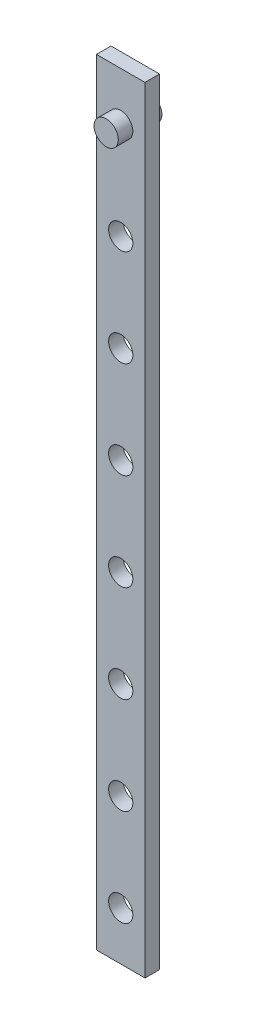
ISO-10303-21;
HEADER;
FILE_DESCRIPTION(('STEP AP214'),'2;1');
FILE_NAME('part.step','',(''),(''),'','','');
FILE_SCHEMA(('AUTOMOTIVE_DESIGN { 1 0 10303 214 1 1 1 1 }'));
ENDSEC;
DATA;
#1=APPLICATION_CONTEXT('core data for automotive mechanical design processes');
#2=APPLICATION_PROTOCOL_DEFINITION('international standard','automotive_design',2000,#1);
#3=PRODUCT_CONTEXT('',#1,'mechanical');
#4=PRODUCT('Part','Part','',(#3));
#5=PRODUCT_RELATED_PRODUCT_CATEGORY('part','',(#4));
#6=PRODUCT_DEFINITION_FORMATION('','',#4);
#7=PRODUCT_DEFINITION_CONTEXT('part definition',#1,'design');
#8=PRODUCT_DEFINITION('design','',#6,#7);
#9=PRODUCT_DEFINITION_SHAPE('','',#8);
#10=(LENGTH_UNIT() NAMED_UNIT(*) SI_UNIT(.MILLI.,.METRE.));
#11=(NAMED_UNIT(*) PLANE_ANGLE_UNIT() SI_UNIT($,.RADIAN.));
#12=(NAMED_UNIT(*) SI_UNIT($,.STERADIAN.) SOLID_ANGLE_UNIT());
#13=UNCERTAINTY_MEASURE_WITH_UNIT(LENGTH_MEASURE(1.E-05),#10,'distance_accuracy_value','');
#14=(GEOMETRIC_REPRESENTATION_CONTEXT(3) GLOBAL_UNCERTAINTY_ASSIGNED_CONTEXT((#13)) GLOBAL_UNIT_ASSIGNED_CONTEXT((#10,
#11,#12)) REPRESENTATION_CONTEXT('',''));
#15=CARTESIAN_POINT('',(0.,0.,0.));
#16=DIRECTION('',(0.,0.,1.));
#17=DIRECTION('',(1.,0.,0.));
#18=AXIS2_PLACEMENT_3D('',#15,#16,#17);
#19=CARTESIAN_POINT('',(0.,0.,3.));
#20=DIRECTION('',(0.,0.,-1.));
#21=DIRECTION('',(-1.,0.,0.));
#22=AXIS2_PLACEMENT_3D('',#19,#20,#21);
#23=PLANE('',#22);
#24=CARTESIAN_POINT('',(0.,70.,3.));
#25=DIRECTION('',(0.,0.,-1.));
#26=DIRECTION('',(-1.,0.,0.));
#27=AXIS2_PLACEMENT_3D('',#24,#25,#26);
#28=CIRCLE('',#27,2.5);
#29=CARTESIAN_POINT('',(-2.5,70.,3.));
#30=VERTEX_POINT('',#29);
#31=EDGE_CURVE('E133',#30,#30,#28,.T.);
#32=ORIENTED_EDGE('',*,*,#31,.T.);
#33=EDGE_LOOP('',(#32));
#34=FACE_BOUND('',#33,.T.);
#35=DIRECTION('',(0.,1.,0.));
#36=VECTOR('',#35,1.);
#37=CARTESIAN_POINT('',(4.99999999999997,-80.,3.));
#38=LINE('',#37,#36);
#39=CARTESIAN_POINT('',(4.99999999999997,-80.,3.));
#40=VERTEX_POINT('',#39);
#41=CARTESIAN_POINT('',(5.00000000000003,80.,3.));
#42=VERTEX_POINT('',#41);
#43=EDGE_CURVE('E86',#40,#42,#38,.T.);
#44=ORIENTED_EDGE('',*,*,#43,.T.);
#45=DIRECTION('',(-1.,0.,0.));
#46=VECTOR('',#45,1.);
#47=CARTESIAN_POINT('',(-4.99999999999997,80.,3.));
#48=LINE('',#47,#46);
#49=CARTESIAN_POINT('',(-4.99999999999997,80.,3.));
#50=VERTEX_POINT('',#49);
#51=EDGE_CURVE('E81',#42,#50,#48,.T.);
#52=ORIENTED_EDGE('',*,*,#51,.T.);
#53=DIRECTION('',(0.,-1.,0.));
#54=VECTOR('',#53,1.);
#55=CARTESIAN_POINT('',(-4.99999999999997,-80.,3.));
#56=LINE('',#55,#54);
#57=CARTESIAN_POINT('',(-4.99999999999997,-80.,3.));
#58=VERTEX_POINT('',#57);
#59=EDGE_CURVE('E84',#50,#58,#56,.T.);
#60=ORIENTED_EDGE('',*,*,#59,.T.);
#61=DIRECTION('',(1.,0.,0.));
#62=VECTOR('',#61,1.);
#63=CARTESIAN_POINT('',(-4.99999999999997,-80.,3.));
#64=LINE('',#63,#62);
#65=EDGE_CURVE('E50',#58,#40,#64,.T.);
#66=ORIENTED_EDGE('',*,*,#65,.T.);
#67=EDGE_LOOP('',(#44,#52,#60,#66));
#68=FACE_BOUND('',#67,.T.);
#69=CARTESIAN_POINT('',(0.,-70.,3.));
#70=DIRECTION('',(0.,0.,1.));
#71=DIRECTION('',(1.,0.,0.));
#72=AXIS2_PLACEMENT_3D('',#69,#70,#71);
#73=CIRCLE('',#72,2.5);
#74=CARTESIAN_POINT('',(2.5,-70.,3.));
#75=VERTEX_POINT('',#74);
#76=EDGE_CURVE('E103',#75,#75,#73,.T.);
#77=ORIENTED_EDGE('',*,*,#76,.F.);
#78=EDGE_LOOP('',(#77));
#79=FACE_BOUND('',#78,.T.);
#80=CARTESIAN_POINT('',(0.,-50.,3.));
#81=DIRECTION('',(0.,0.,1.));
#82=DIRECTION('',(1.,0.,0.));
#83=AXIS2_PLACEMENT_3D('',#80,#81,#82);
#84=CIRCLE('',#83,2.5);
#85=CARTESIAN_POINT('',(2.5,-50.,3.));
#86=VERTEX_POINT('',#85);
#87=EDGE_CURVE('E162',#86,#86,#84,.T.);
#88=ORIENTED_EDGE('',*,*,#87,.F.);
#89=EDGE_LOOP('',(#88));
#90=FACE_BOUND('',#89,.T.);
#91=CARTESIAN_POINT('',(0.,-30.,3.));
#92=DIRECTION('',(0.,0.,1.));
#93=DIRECTION('',(1.,0.,0.));
#94=AXIS2_PLACEMENT_3D('',#91,#92,#93);
#95=CIRCLE('',#94,2.5);
#96=CARTESIAN_POINT('',(2.5,-30.,3.));
#97=VERTEX_POINT('',#96);
#98=EDGE_CURVE('E157',#97,#97,#95,.T.);
#99=ORIENTED_EDGE('',*,*,#98,.F.);
#100=EDGE_LOOP('',(#99));
#101=FACE_BOUND('',#100,.T.);
#102=CARTESIAN_POINT('',(0.,-10.,3.));
#103=DIRECTION('',(0.,0.,1.));
#104=DIRECTION('',(1.,0.,0.));
#105=AXIS2_PLACEMENT_3D('',#102,#103,#104);
#106=CIRCLE('',#105,2.5);
#107=CARTESIAN_POINT('',(2.5,-10.,3.));
#108=VERTEX_POINT('',#107);
#109=EDGE_CURVE('E152',#108,#108,#106,.T.);
#110=ORIENTED_EDGE('',*,*,#109,.F.);
#111=EDGE_LOOP('',(#110));
#112=FACE_BOUND('',#111,.T.);
#113=CARTESIAN_POINT('',(0.,9.99999999999997,3.));
#114=DIRECTION('',(0.,0.,1.));
#115=DIRECTION('',(1.,0.,0.));
#116=AXIS2_PLACEMENT_3D('',#113,#114,#115);
#117=CIRCLE('',#116,2.5);
#118=CARTESIAN_POINT('',(2.5,9.99999999999997,3.));
#119=VERTEX_POINT('',#118);
#120=EDGE_CURVE('E147',#119,#119,#117,.T.);
#121=ORIENTED_EDGE('',*,*,#120,.F.);
#122=EDGE_LOOP('',(#121));
#123=FACE_BOUND('',#122,.T.);
#124=CARTESIAN_POINT('',(0.,30.,3.));
#125=DIRECTION('',(0.,0.,1.));
#126=DIRECTION('',(1.,0.,0.));
#127=AXIS2_PLACEMENT_3D('',#124,#125,#126);
#128=CIRCLE('',#127,2.5);
#129=CARTESIAN_POINT('',(2.5,30.,3.));
#130=VERTEX_POINT('',#129);
#131=EDGE_CURVE('E142',#130,#130,#128,.T.);
#132=ORIENTED_EDGE('',*,*,#131,.F.);
#133=EDGE_LOOP('',(#132));
#134=FACE_BOUND('',#133,.T.);
#135=CARTESIAN_POINT('',(0.,50.,3.));
#136=DIRECTION('',(0.,0.,1.));
#137=DIRECTION('',(1.,0.,0.));
#138=AXIS2_PLACEMENT_3D('',#135,#136,#137);
#139=CIRCLE('',#138,2.5);
#140=CARTESIAN_POINT('',(2.5,50.,3.));
#141=VERTEX_POINT('',#140);
#142=EDGE_CURVE('E132',#141,#141,#139,.T.);
#143=ORIENTED_EDGE('',*,*,#142,.F.);
#144=EDGE_LOOP('',(#143));
#145=FACE_BOUND('',#144,.T.);
#146=ADVANCED_FACE('F33',(#34,#68,#79,#90,#101,#112,#123,#134,#145),#23,.F.);
#147=CARTESIAN_POINT('',(0.,0.,0.));
#148=DIRECTION('',(0.,0.,-1.));
#149=DIRECTION('',(-1.,0.,0.));
#150=AXIS2_PLACEMENT_3D('',#147,#148,#149);
#151=PLANE('',#150);
#152=CARTESIAN_POINT('',(0.,70.,0.));
#153=DIRECTION('',(0.,0.,-1.));
#154=DIRECTION('',(-1.,0.,0.));
#155=AXIS2_PLACEMENT_3D('',#152,#153,#154);
#156=CIRCLE('',#155,2.5);
#157=CARTESIAN_POINT('',(-2.5,70.,0.));
#158=VERTEX_POINT('',#157);
#159=EDGE_CURVE('E11',#158,#158,#156,.T.);
#160=ORIENTED_EDGE('',*,*,#159,.F.);
#161=EDGE_LOOP('',(#160));
#162=FACE_BOUND('',#161,.T.);
#163=CARTESIAN_POINT('',(0.,30.,0.));
#164=DIRECTION('',(0.,0.,1.));
#165=DIRECTION('',(1.,0.,0.));
#166=AXIS2_PLACEMENT_3D('',#163,#164,#165);
#167=CIRCLE('',#166,2.5);
#168=CARTESIAN_POINT('',(2.5,30.,0.));
#169=VERTEX_POINT('',#168);
#170=EDGE_CURVE('E136',#169,#169,#167,.T.);
#171=ORIENTED_EDGE('',*,*,#170,.T.);
#172=EDGE_LOOP('',(#171));
#173=FACE_BOUND('',#172,.T.);
#174=CARTESIAN_POINT('',(0.,-10.,0.));
#175=DIRECTION('',(0.,0.,1.));
#176=DIRECTION('',(1.,0.,0.));
#177=AXIS2_PLACEMENT_3D('',#174,#175,#176);
#178=CIRCLE('',#177,2.5);
#179=CARTESIAN_POINT('',(2.5,-10.,0.));
#180=VERTEX_POINT('',#179);
#181=EDGE_CURVE('E150',#180,#180,#178,.T.);
#182=ORIENTED_EDGE('',*,*,#181,.T.);
#183=EDGE_LOOP('',(#182));
#184=FACE_BOUND('',#183,.T.);
#185=CARTESIAN_POINT('',(0.,-50.,0.));
#186=DIRECTION('',(0.,0.,1.));
#187=DIRECTION('',(1.,0.,0.));
#188=AXIS2_PLACEMENT_3D('',#185,#186,#187);
#189=CIRCLE('',#188,2.5);
#190=CARTESIAN_POINT('',(2.5,-50.,0.));
#191=VERTEX_POINT('',#190);
#192=EDGE_CURVE('E160',#191,#191,#189,.T.);
#193=ORIENTED_EDGE('',*,*,#192,.T.);
#194=EDGE_LOOP('',(#193));
#195=FACE_BOUND('',#194,.T.);
#196=DIRECTION('',(0.,1.,0.));
#197=VECTOR('',#196,1.);
#198=CARTESIAN_POINT('',(4.99999999999997,-80.,0.));
#199=LINE('',#198,#197);
#200=CARTESIAN_POINT('',(4.99999999999997,-80.,0.));
#201=VERTEX_POINT('',#200);
#202=CARTESIAN_POINT('',(5.00000000000003,80.,0.));
#203=VERTEX_POINT('',#202);
#204=EDGE_CURVE('E100',#201,#203,#199,.T.);
#205=ORIENTED_EDGE('',*,*,#204,.F.);
#206=DIRECTION('',(1.,0.,0.));
#207=VECTOR('',#206,1.);
#208=CARTESIAN_POINT('',(-4.99999999999997,-80.,0.));
#209=LINE('',#208,#207);
#210=CARTESIAN_POINT('',(-4.99999999999997,-80.,0.));
#211=VERTEX_POINT('',#210);
#212=EDGE_CURVE('E73',#211,#201,#209,.T.);
#213=ORIENTED_EDGE('',*,*,#212,.F.);
#214=DIRECTION('',(0.,-1.,0.));
#215=VECTOR('',#214,1.);
#216=CARTESIAN_POINT('',(-4.99999999999997,-80.,0.));
#217=LINE('',#216,#215);
#218=CARTESIAN_POINT('',(-4.99999999999997,80.,0.));
#219=VERTEX_POINT('',#218);
#220=EDGE_CURVE('E67',#219,#211,#217,.T.);
#221=ORIENTED_EDGE('',*,*,#220,.F.);
#222=DIRECTION('',(-1.,0.,0.));
#223=VECTOR('',#222,1.);
#224=CARTESIAN_POINT('',(-4.99999999999997,80.,0.));
#225=LINE('',#224,#223);
#226=EDGE_CURVE('E91',#203,#219,#225,.T.);
#227=ORIENTED_EDGE('',*,*,#226,.F.);
#228=EDGE_LOOP('',(#205,#213,#221,#227));
#229=FACE_BOUND('',#228,.T.);
#230=CARTESIAN_POINT('',(0.,-70.,0.));
#231=DIRECTION('',(0.,0.,1.));
#232=DIRECTION('',(1.,0.,0.));
#233=AXIS2_PLACEMENT_3D('',#230,#231,#232);
#234=CIRCLE('',#233,2.5);
#235=CARTESIAN_POINT('',(2.5,-70.,0.));
#236=VERTEX_POINT('',#235);
#237=EDGE_CURVE('E119',#236,#236,#234,.T.);
#238=ORIENTED_EDGE('',*,*,#237,.T.);
#239=EDGE_LOOP('',(#238));
#240=FACE_BOUND('',#239,.T.);
#241=CARTESIAN_POINT('',(0.,-30.,0.));
#242=DIRECTION('',(0.,0.,1.));
#243=DIRECTION('',(1.,0.,0.));
#244=AXIS2_PLACEMENT_3D('',#241,#242,#243);
#245=CIRCLE('',#244,2.5);
#246=CARTESIAN_POINT('',(2.5,-30.,0.));
#247=VERTEX_POINT('',#246);
#248=EDGE_CURVE('E123',#247,#247,#245,.T.);
#249=ORIENTED_EDGE('',*,*,#248,.T.);
#250=EDGE_LOOP('',(#249));
#251=FACE_BOUND('',#250,.T.);
#252=CARTESIAN_POINT('',(0.,9.99999999999997,0.));
#253=DIRECTION('',(0.,0.,1.));
#254=DIRECTION('',(1.,0.,0.));
#255=AXIS2_PLACEMENT_3D('',#252,#253,#254);
#256=CIRCLE('',#255,2.5);
#257=CARTESIAN_POINT('',(2.5,9.99999999999997,0.));
#258=VERTEX_POINT('',#257);
#259=EDGE_CURVE('E127',#258,#258,#256,.T.);
#260=ORIENTED_EDGE('',*,*,#259,.T.);
#261=EDGE_LOOP('',(#260));
#262=FACE_BOUND('',#261,.T.);
#263=CARTESIAN_POINT('',(0.,50.,0.));
#264=DIRECTION('',(0.,0.,1.));
#265=DIRECTION('',(1.,0.,0.));
#266=AXIS2_PLACEMENT_3D('',#263,#264,#265);
#267=CIRCLE('',#266,2.5);
#268=CARTESIAN_POINT('',(2.5,50.,0.));
#269=VERTEX_POINT('',#268);
#270=EDGE_CURVE('E130',#269,#269,#267,.T.);
#271=ORIENTED_EDGE('',*,*,#270,.T.);
#272=EDGE_LOOP('',(#271));
#273=FACE_BOUND('',#272,.T.);
#274=ADVANCED_FACE('F111',(#162,#173,#184,#195,#229,#240,#251,#262,#273),#151,.T.);
#275=CARTESIAN_POINT('',(4.99999999999997,-80.,3.));
#276=DIRECTION('',(-1.,0.,0.));
#277=DIRECTION('',(0.,-1.,0.));
#278=AXIS2_PLACEMENT_3D('',#275,#276,#277);
#279=PLANE('',#278);
#280=ORIENTED_EDGE('',*,*,#204,.T.);
#281=DIRECTION('',(0.,0.,-1.));
#282=VECTOR('',#281,1.);
#283=CARTESIAN_POINT('',(5.00000000000003,80.,3.));
#284=LINE('',#283,#282);
#285=EDGE_CURVE('E42',#42,#203,#284,.T.);
#286=ORIENTED_EDGE('',*,*,#285,.F.);
#287=ORIENTED_EDGE('',*,*,#43,.F.);
#288=DIRECTION('',(0.,0.,-1.));
#289=VECTOR('',#288,1.);
#290=CARTESIAN_POINT('',(4.99999999999997,-80.,3.));
#291=LINE('',#290,#289);
#292=EDGE_CURVE('E96',#40,#201,#291,.T.);
#293=ORIENTED_EDGE('',*,*,#292,.T.);
#294=EDGE_LOOP('',(#280,#286,#287,#293));
#295=FACE_BOUND('',#294,.T.);
#296=ADVANCED_FACE('F35',(#295),#279,.F.);
#297=CARTESIAN_POINT('',(-4.99999999999997,80.,3.));
#298=DIRECTION('',(0.,-1.,0.));
#299=DIRECTION('',(0.,0.,-1.));
#300=AXIS2_PLACEMENT_3D('',#297,#298,#299);
#301=PLANE('',#300);
#302=ORIENTED_EDGE('',*,*,#226,.T.);
#303=DIRECTION('',(0.,0.,-1.));
#304=VECTOR('',#303,1.);
#305=CARTESIAN_POINT('',(-4.99999999999997,80.,3.));
#306=LINE('',#305,#304);
#307=EDGE_CURVE('E89',#50,#219,#306,.T.);
#308=ORIENTED_EDGE('',*,*,#307,.F.);
#309=ORIENTED_EDGE('',*,*,#51,.F.);
#310=ORIENTED_EDGE('',*,*,#285,.T.);
#311=EDGE_LOOP('',(#302,#308,#309,#310));
#312=FACE_BOUND('',#311,.T.);
#313=ADVANCED_FACE('F90',(#312),#301,.F.);
#314=CARTESIAN_POINT('',(-4.99999999999997,-80.,3.));
#315=DIRECTION('',(1.,0.,0.));
#316=DIRECTION('',(0.,0.,-1.));
#317=AXIS2_PLACEMENT_3D('',#314,#315,#316);
#318=PLANE('',#317);
#319=ORIENTED_EDGE('',*,*,#220,.T.);
#320=DIRECTION('',(0.,0.,-1.));
#321=VECTOR('',#320,1.);
#322=CARTESIAN_POINT('',(-4.99999999999997,-80.,3.));
#323=LINE('',#322,#321);
#324=EDGE_CURVE('E92',#58,#211,#323,.T.);
#325=ORIENTED_EDGE('',*,*,#324,.F.);
#326=ORIENTED_EDGE('',*,*,#59,.F.);
#327=ORIENTED_EDGE('',*,*,#307,.T.);
#328=EDGE_LOOP('',(#319,#325,#326,#327));
#329=FACE_BOUND('',#328,.T.);
#330=ADVANCED_FACE('F94',(#329),#318,.F.);
#331=CARTESIAN_POINT('',(-4.99999999999997,-80.,3.));
#332=DIRECTION('',(0.,1.,0.));
#333=DIRECTION('',(0.,0.,1.));
#334=AXIS2_PLACEMENT_3D('',#331,#332,#333);
#335=PLANE('',#334);
#336=ORIENTED_EDGE('',*,*,#212,.T.);
#337=ORIENTED_EDGE('',*,*,#292,.F.);
#338=ORIENTED_EDGE('',*,*,#65,.F.);
#339=ORIENTED_EDGE('',*,*,#324,.T.);
#340=EDGE_LOOP('',(#336,#337,#338,#339));
#341=FACE_BOUND('',#340,.T.);
#342=ADVANCED_FACE('F222',(#341),#335,.F.);
#343=CARTESIAN_POINT('',(0.,-70.,3.));
#344=DIRECTION('',(0.,0.,-1.));
#345=DIRECTION('',(-1.,0.,0.));
#346=AXIS2_PLACEMENT_3D('',#343,#344,#345);
#347=CYLINDRICAL_SURFACE('',#346,2.5);
#348=ORIENTED_EDGE('',*,*,#76,.T.);
#349=EDGE_LOOP('',(#348));
#350=FACE_BOUND('',#349,.T.);
#351=ORIENTED_EDGE('',*,*,#237,.F.);
#352=EDGE_LOOP('',(#351));
#353=FACE_BOUND('',#352,.T.);
#354=ADVANCED_FACE('F171',(#350,#353),#347,.F.);
#355=CARTESIAN_POINT('',(0.,-50.,3.));
#356=DIRECTION('',(0.,0.,-1.));
#357=DIRECTION('',(-1.,0.,0.));
#358=AXIS2_PLACEMENT_3D('',#355,#356,#357);
#359=CYLINDRICAL_SURFACE('',#358,2.5);
#360=ORIENTED_EDGE('',*,*,#87,.T.);
#361=EDGE_LOOP('',(#360));
#362=FACE_BOUND('',#361,.T.);
#363=ORIENTED_EDGE('',*,*,#192,.F.);
#364=EDGE_LOOP('',(#363));
#365=FACE_BOUND('',#364,.T.);
#366=ADVANCED_FACE('F216',(#362,#365),#359,.F.);
#367=CARTESIAN_POINT('',(0.,-30.,3.));
#368=DIRECTION('',(0.,0.,-1.));
#369=DIRECTION('',(-1.,0.,0.));
#370=AXIS2_PLACEMENT_3D('',#367,#368,#369);
#371=CYLINDRICAL_SURFACE('',#370,2.5);
#372=ORIENTED_EDGE('',*,*,#98,.T.);
#373=EDGE_LOOP('',(#372));
#374=FACE_BOUND('',#373,.T.);
#375=ORIENTED_EDGE('',*,*,#248,.F.);
#376=EDGE_LOOP('',(#375));
#377=FACE_BOUND('',#376,.T.);
#378=ADVANCED_FACE('F212',(#374,#377),#371,.F.);
#379=CARTESIAN_POINT('',(0.,-10.,3.));
#380=DIRECTION('',(0.,0.,-1.));
#381=DIRECTION('',(-1.,0.,0.));
#382=AXIS2_PLACEMENT_3D('',#379,#380,#381);
#383=CYLINDRICAL_SURFACE('',#382,2.5);
#384=ORIENTED_EDGE('',*,*,#109,.T.);
#385=EDGE_LOOP('',(#384));
#386=FACE_BOUND('',#385,.T.);
#387=ORIENTED_EDGE('',*,*,#181,.F.);
#388=EDGE_LOOP('',(#387));
#389=FACE_BOUND('',#388,.T.);
#390=ADVANCED_FACE('F208',(#386,#389),#383,.F.);
#391=CARTESIAN_POINT('',(0.,9.99999999999997,3.));
#392=DIRECTION('',(0.,0.,-1.));
#393=DIRECTION('',(-1.,0.,0.));
#394=AXIS2_PLACEMENT_3D('',#391,#392,#393);
#395=CYLINDRICAL_SURFACE('',#394,2.5);
#396=ORIENTED_EDGE('',*,*,#120,.T.);
#397=EDGE_LOOP('',(#396));
#398=FACE_BOUND('',#397,.T.);
#399=ORIENTED_EDGE('',*,*,#259,.F.);
#400=EDGE_LOOP('',(#399));
#401=FACE_BOUND('',#400,.T.);
#402=ADVANCED_FACE('F201',(#398,#401),#395,.F.);
#403=CARTESIAN_POINT('',(0.,30.,3.));
#404=DIRECTION('',(0.,0.,-1.));
#405=DIRECTION('',(-1.,0.,0.));
#406=AXIS2_PLACEMENT_3D('',#403,#404,#405);
#407=CYLINDRICAL_SURFACE('',#406,2.5);
#408=ORIENTED_EDGE('',*,*,#131,.T.);
#409=EDGE_LOOP('',(#408));
#410=FACE_BOUND('',#409,.T.);
#411=ORIENTED_EDGE('',*,*,#170,.F.);
#412=EDGE_LOOP('',(#411));
#413=FACE_BOUND('',#412,.T.);
#414=ADVANCED_FACE('F192',(#410,#413),#407,.F.);
#415=CARTESIAN_POINT('',(0.,50.,3.));
#416=DIRECTION('',(0.,0.,-1.));
#417=DIRECTION('',(-1.,0.,0.));
#418=AXIS2_PLACEMENT_3D('',#415,#416,#417);
#419=CYLINDRICAL_SURFACE('',#418,2.5);
#420=ORIENTED_EDGE('',*,*,#142,.T.);
#421=EDGE_LOOP('',(#420));
#422=FACE_BOUND('',#421,.T.);
#423=ORIENTED_EDGE('',*,*,#270,.F.);
#424=EDGE_LOOP('',(#423));
#425=FACE_BOUND('',#424,.T.);
#426=ADVANCED_FACE('F189',(#422,#425),#419,.F.);
#427=CARTESIAN_POINT('',(0.,70.,-3.));
#428=DIRECTION('',(0.,0.,1.));
#429=DIRECTION('',(1.,0.,0.));
#430=AXIS2_PLACEMENT_3D('',#427,#428,#429);
#431=PLANE('',#430);
#432=CARTESIAN_POINT('',(0.,70.,-3.));
#433=DIRECTION('',(0.,0.,1.));
#434=DIRECTION('',(1.,0.,0.));
#435=AXIS2_PLACEMENT_3D('',#432,#433,#434);
#436=CIRCLE('',#435,2.5);
#437=CARTESIAN_POINT('',(2.5,70.,-3.));
#438=VERTEX_POINT('',#437);
#439=EDGE_CURVE('E139',#438,#438,#436,.T.);
#440=ORIENTED_EDGE('',*,*,#439,.F.);
#441=EDGE_LOOP('',(#440));
#442=FACE_BOUND('',#441,.T.);
#443=ADVANCED_FACE('F191',(#442),#431,.F.);
#444=CARTESIAN_POINT('',(0.,70.,-3.));
#445=DIRECTION('',(0.,0.,1.));
#446=DIRECTION('',(1.,0.,0.));
#447=AXIS2_PLACEMENT_3D('',#444,#445,#446);
#448=CYLINDRICAL_SURFACE('',#447,2.5);
#449=ORIENTED_EDGE('',*,*,#159,.T.);
#450=EDGE_LOOP('',(#449));
#451=FACE_BOUND('',#450,.T.);
#452=ORIENTED_EDGE('',*,*,#439,.T.);
#453=EDGE_LOOP('',(#452));
#454=FACE_BOUND('',#453,.T.);
#455=ADVANCED_FACE('F198',(#451,#454),#448,.T.);
#456=CARTESIAN_POINT('',(0.,70.,6.));
#457=DIRECTION('',(0.,0.,1.));
#458=DIRECTION('',(1.,0.,0.));
#459=AXIS2_PLACEMENT_3D('',#456,#457,#458);
#460=CIRCLE('',#459,2.5);
#461=CARTESIAN_POINT('',(2.5,70.,6.));
#462=VERTEX_POINT('',#461);
#463=EDGE_CURVE('E340',#462,#462,#460,.T.);
#464=ORIENTED_EDGE('',*,*,#463,.F.);
#465=EDGE_LOOP('',(#464));
#466=FACE_BOUND('',#465,.T.);
#467=ORIENTED_EDGE('',*,*,#31,.F.);
#468=EDGE_LOOP('',(#467));
#469=FACE_BOUND('',#468,.T.);
#470=ADVANCED_FACE('F316',(#466,#469),#448,.T.);
#471=CARTESIAN_POINT('',(0.,70.,6.));
#472=DIRECTION('',(0.,0.,1.));
#473=DIRECTION('',(1.,0.,0.));
#474=AXIS2_PLACEMENT_3D('',#471,#472,#473);
#475=PLANE('',#474);
#476=ORIENTED_EDGE('',*,*,#463,.T.);
#477=EDGE_LOOP('',(#476));
#478=FACE_BOUND('',#477,.T.);
#479=ADVANCED_FACE('F324',(#478),#475,.T.);
#480=CLOSED_SHELL('',(#146,#274,#296,#313,#330,#342,#354,#366,#378,#390,#402,#414,#426,#443,
#455,#470,#479));
#481=MANIFOLD_SOLID_BREP('B2',#480);
#482=ADVANCED_BREP_SHAPE_REPRESENTATION('',(#18,#481),#14);
#483=SHAPE_DEFINITION_REPRESENTATION(#9,#482);
ENDSEC;
END-ISO-10303-21;
